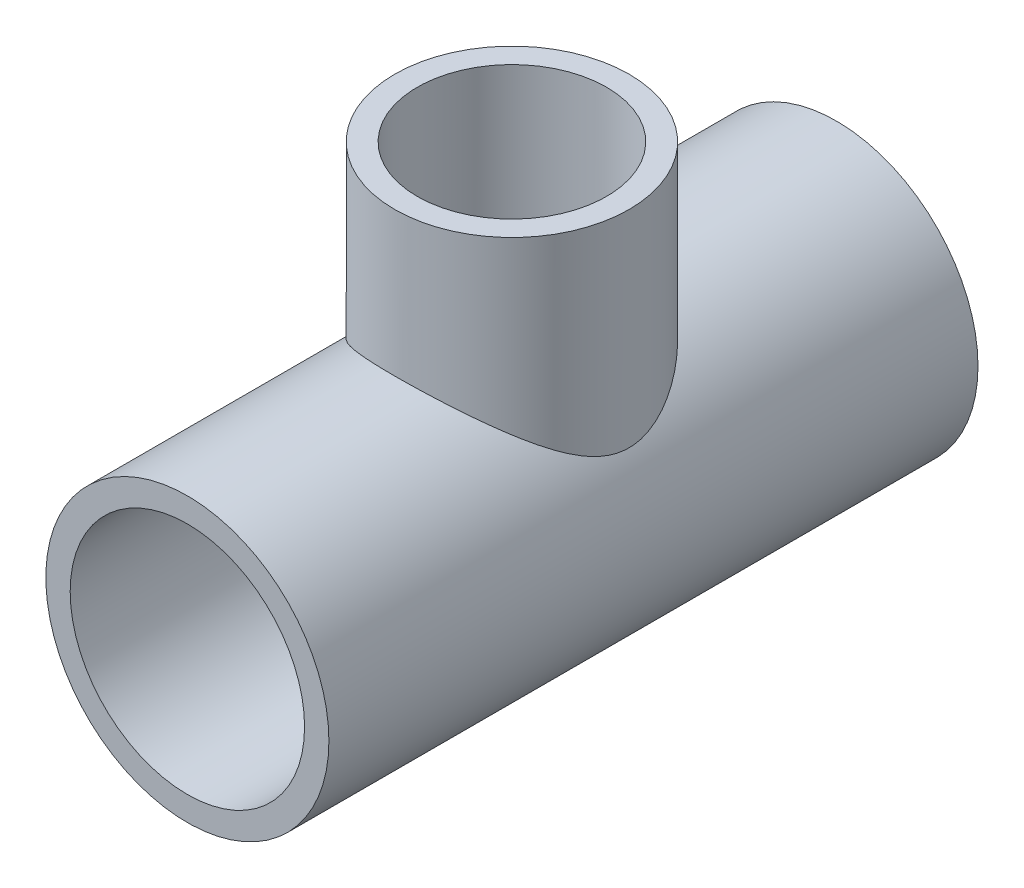
ISO-10303-21;
HEADER;
FILE_DESCRIPTION(('STEP AP214'),'2;1');
FILE_NAME('part.step','',(''),(''),'','','');
FILE_SCHEMA(('AUTOMOTIVE_DESIGN { 1 0 10303 214 1 1 1 1 }'));
ENDSEC;
DATA;
#1=APPLICATION_CONTEXT('core data for automotive mechanical design processes');
#2=APPLICATION_PROTOCOL_DEFINITION('international standard','automotive_design',2000,#1);
#3=PRODUCT_CONTEXT('',#1,'mechanical');
#4=PRODUCT('Part','Part','',(#3));
#5=PRODUCT_RELATED_PRODUCT_CATEGORY('part','',(#4));
#6=PRODUCT_DEFINITION_FORMATION('','',#4);
#7=PRODUCT_DEFINITION_CONTEXT('part definition',#1,'design');
#8=PRODUCT_DEFINITION('design','',#6,#7);
#9=PRODUCT_DEFINITION_SHAPE('','',#8);
#10=(LENGTH_UNIT() NAMED_UNIT(*) SI_UNIT(.MILLI.,.METRE.));
#11=(NAMED_UNIT(*) PLANE_ANGLE_UNIT() SI_UNIT($,.RADIAN.));
#12=(NAMED_UNIT(*) SI_UNIT($,.STERADIAN.) SOLID_ANGLE_UNIT());
#13=UNCERTAINTY_MEASURE_WITH_UNIT(LENGTH_MEASURE(1.E-05),#10,'distance_accuracy_value','');
#14=(GEOMETRIC_REPRESENTATION_CONTEXT(3) GLOBAL_UNCERTAINTY_ASSIGNED_CONTEXT((#13)) GLOBAL_UNIT_ASSIGNED_CONTEXT((#10,
#11,#12)) REPRESENTATION_CONTEXT('',''));
#15=CARTESIAN_POINT('',(0.,0.,0.));
#16=DIRECTION('',(0.,0.,1.));
#17=DIRECTION('',(1.,0.,0.));
#18=AXIS2_PLACEMENT_3D('',#15,#16,#17);
#19=CARTESIAN_POINT('',(0.,0.,91.44));
#20=DIRECTION('',(0.,0.,-1.));
#21=DIRECTION('',(-1.,0.,0.));
#22=AXIS2_PLACEMENT_3D('',#19,#20,#21);
#23=CYLINDRICAL_SURFACE('',#22,19.939);
#24=CARTESIAN_POINT('',(0.,19.939,62.23));
#25=CARTESIAN_POINT('',(-0.392783405292877,19.9389961701152,62.2299960612544));
#26=CARTESIAN_POINT('',(-0.785640186108571,19.9273668865796,62.2159565841073));
#27=CARTESIAN_POINT('',(-1.56805239338916,19.8811123017853,62.1600500239623));
#28=CARTESIAN_POINT('',(-1.95760696256745,19.8464812036583,62.1181759261404));
#29=CARTESIAN_POINT('',(-2.73057137688883,19.754981748979,62.0073160234988));
#30=CARTESIAN_POINT('',(-3.1139748252652,19.6980916305771,61.938303686257));
#31=CARTESIAN_POINT('',(-3.87138557414284,19.5633350384613,61.7743649373392));
#32=CARTESIAN_POINT('',(-4.24539325198439,19.4854694086146,61.6794395681703));
#33=CARTESIAN_POINT('',(-4.97936657296411,19.3109053626636,61.4658314693263));
#34=CARTESIAN_POINT('',(-5.33940489736045,19.2143266977219,61.3472996775844));
#35=CARTESIAN_POINT('',(-6.04600321066344,19.0038282317555,61.0877464139055));
#36=CARTESIAN_POINT('',(-6.39256335183005,18.889908626699,60.9467251961182));
#37=CARTESIAN_POINT('',(-7.0708141324814,18.6466382408793,60.6438613108664));
#38=CARTESIAN_POINT('',(-7.40250468938375,18.5172873744289,60.4820185277827));
#39=CARTESIAN_POINT('',(-8.05006725828212,18.2450969909378,60.1391127084111));
#40=CARTESIAN_POINT('',(-8.36593590835296,18.1022546255998,59.9580456125205));
#41=CARTESIAN_POINT('',(-9.09332768357189,17.7508409542491,59.5089390834768));
#42=CARTESIAN_POINT('',(-9.4977508332775,17.53728942011,59.2332547338749));
#43=CARTESIAN_POINT('',(-10.2749387941315,17.0935585190217,58.6521823962372));
#44=CARTESIAN_POINT('',(-10.6476928919433,16.8633735734959,58.3467844307281));
#45=CARTESIAN_POINT('',(-11.3620214838154,16.3906090166872,57.7081068881305));
#46=CARTESIAN_POINT('',(-11.7035141630012,16.1479993354566,57.3747582918527));
#47=CARTESIAN_POINT('',(-12.3541212827913,15.6558535879754,56.6827255812915));
#48=CARTESIAN_POINT('',(-12.6632397406975,15.4063183859821,56.3240446197601));
#49=CARTESIAN_POINT('',(-13.2543571821007,14.9009926097728,55.5756387502431));
#50=CARTESIAN_POINT('',(-13.5357692254304,14.6451701912157,55.1854719114607));
#51=CARTESIAN_POINT('',(-14.0647961459784,14.1378747352497,54.3799023256704));
#52=CARTESIAN_POINT('',(-14.312399743478,13.8864031737623,53.9644912227381));
#53=CARTESIAN_POINT('',(-14.7722204215409,13.3961875161993,53.1089751497637));
#54=CARTESIAN_POINT('',(-14.9845230142917,13.1574136458984,52.6689334090436));
#55=CARTESIAN_POINT('',(-15.3725233866393,12.7019099754091,51.7622225908647));
#56=CARTESIAN_POINT('',(-15.5482525311853,12.4851613689479,51.2955767699788));
#57=CARTESIAN_POINT('',(-15.7900241058665,12.1761429268623,50.5503943005047));
#58=CARTESIAN_POINT('',(-15.8699108915205,12.0716464920868,50.2813663084645));
#59=CARTESIAN_POINT('',(-16.016869639299,11.8759653175975,49.7349748333035));
#60=CARTESIAN_POINT('',(-16.0839399548237,11.7847822886818,49.4576102844317));
#61=CARTESIAN_POINT('',(-16.2042489317599,11.6188016750439,48.895656587861));
#62=CARTESIAN_POINT('',(-16.25751487572,11.5439718170228,48.6110829297272));
#63=CARTESIAN_POINT('',(-16.3494366490625,11.4134147135974,48.0353661788215));
#64=CARTESIAN_POINT('',(-16.3881001327055,11.3576774617347,47.7442266127928));
#65=CARTESIAN_POINT('',(-16.4503741657615,11.2672974773367,47.153376275942));
#66=CARTESIAN_POINT('',(-16.4737958676471,11.2329196176889,46.85360432071));
#67=CARTESIAN_POINT('',(-16.5041973207895,11.1882054490934,46.2514378010779));
#68=CARTESIAN_POINT('',(-16.5111784647061,11.1778671037885,45.9490434609951));
#69=CARTESIAN_POINT('',(-16.5084964830161,11.1818276693203,45.3444425522472));
#70=CARTESIAN_POINT('',(-16.4988306865683,11.1961305336019,45.0422360214965));
#71=CARTESIAN_POINT('',(-16.4631322681893,11.2485544120525,44.4408791630354));
#72=CARTESIAN_POINT('',(-16.4370975667211,11.2866784525055,44.1417292285489));
#73=CARTESIAN_POINT('',(-16.3660629342201,11.3894670643618,43.5201899009702));
#74=CARTESIAN_POINT('',(-16.3194721560966,11.4563421026462,43.1983514577935));
#75=CARTESIAN_POINT('',(-16.2086306654485,11.6126286336025,42.5633629858421));
#76=CARTESIAN_POINT('',(-16.1443769656807,11.7020439381864,42.2502144366182));
#77=CARTESIAN_POINT('',(-15.9992851646176,11.8996481363419,41.6329750138552));
#78=CARTESIAN_POINT('',(-15.9184040827348,12.0078855697197,41.328910001592));
#79=CARTESIAN_POINT('',(-15.7412666797049,12.2391788142262,40.731023514651));
#80=CARTESIAN_POINT('',(-15.6450044145547,12.3622403495328,40.4372060537986));
#81=CARTESIAN_POINT('',(-15.3785985492522,12.6936926931827,39.6940557814326));
#82=CARTESIAN_POINT('',(-15.1977687032512,12.9105082291697,39.2522904237967));
#83=CARTESIAN_POINT('',(-14.802764076096,13.3615856567957,38.393202224307));
#84=CARTESIAN_POINT('',(-14.5885704216906,13.5958573836905,37.975893402055));
#85=CARTESIAN_POINT('',(-14.1279419413708,14.073924002867,37.1643422464437));
#86=CARTESIAN_POINT('',(-13.8814645979965,14.3177311509361,36.7701313415924));
#87=CARTESIAN_POINT('',(-13.3572075657742,14.8080241659555,36.0050584857791));
#88=CARTESIAN_POINT('',(-13.0794339746337,15.0545095026648,35.6341920083019));
#89=CARTESIAN_POINT('',(-12.4788575456819,15.5564190719477,34.8990001292566));
#90=CARTESIAN_POINT('',(-12.154545003236,15.811713670453,34.5358167053663));
#91=CARTESIAN_POINT('',(-11.4717717450427,16.3138531096182,33.8365098770111));
#92=CARTESIAN_POINT('',(-11.1133059132954,16.560696676802,33.5003905405753));
#93=CARTESIAN_POINT('',(-10.3631342690973,17.0401575050117,32.8580840228777));
#94=CARTESIAN_POINT('',(-9.97149527210491,17.2728018115195,32.5518392279916));
#95=CARTESIAN_POINT('',(-9.15494659320233,17.7191130501294,31.9716301317617));
#96=CARTESIAN_POINT('',(-8.73004907452329,17.9327868596261,31.6976541201196));
#97=CARTESIAN_POINT('',(-7.9608320367902,18.2844000648241,31.2510875843767));
#98=CARTESIAN_POINT('',(-7.62362342090317,18.4277504288897,31.0704673204951));
#99=CARTESIAN_POINT('',(-6.9323931798753,18.6987531063733,30.7309972779359));
#100=CARTESIAN_POINT('',(-6.57837561414232,18.8264091835433,30.5721422785344));
#101=CARTESIAN_POINT('',(-5.85495857615085,19.0637885586551,30.2781110577493));
#102=CARTESIAN_POINT('',(-5.48556498008741,19.17351862977,30.1429258915488));
#103=CARTESIAN_POINT('',(-4.73312160048301,19.3729900132641,29.898047936171));
#104=CARTESIAN_POINT('',(-4.35007157070589,19.4627309650121,29.7883556069178));
#105=CARTESIAN_POINT('',(-3.56990463548356,19.6208828498744,29.5955313250195));
#106=CARTESIAN_POINT('',(-3.1727054099056,19.6891331721679,29.5125992571348));
#107=CARTESIAN_POINT('',(-2.36995626110336,19.8017997821328,29.3759138090709));
#108=CARTESIAN_POINT('',(-1.96440632759534,19.8462160404513,29.322160464827));
#109=CARTESIAN_POINT('',(-1.14865255085361,19.9100884716174,29.2449135252215));
#110=CARTESIAN_POINT('',(-0.738450848231068,19.9295556897874,29.2214065393154));
#111=CARTESIAN_POINT('',(0.0829610907733879,19.9430566799419,29.2051002619036));
#112=CARTESIAN_POINT('',(0.494171225915968,19.9370929083152,29.2122980046166));
#113=CARTESIAN_POINT('',(1.26739282046415,19.9020072756767,29.2546914480175));
#114=CARTESIAN_POINT('',(1.62971283203527,19.8755785175611,29.2866313658267));
#115=CARTESIAN_POINT('',(2.34952393229969,19.8033902036354,29.3740142357515));
#116=CARTESIAN_POINT('',(2.70701545507254,19.7576323975989,29.4294550604352));
#117=CARTESIAN_POINT('',(3.41485561273787,19.6476664676419,29.5630012012198));
#118=CARTESIAN_POINT('',(3.7652037372405,19.5834570302806,29.6411081307638));
#119=CARTESIAN_POINT('',(4.45670353678169,19.437756748633,29.8188881047043));
#120=CARTESIAN_POINT('',(4.79785473535906,19.3562650109419,29.9185622640198));
#121=CARTESIAN_POINT('',(5.47678568258123,19.1753675719841,30.1406756741876));
#122=CARTESIAN_POINT('',(5.8143179275952,19.0756008707597,30.2635756415255));
#123=CARTESIAN_POINT('',(6.47653838181714,18.8610533726083,30.5291528456473));
#124=CARTESIAN_POINT('',(6.80122678247126,18.746272799583,30.6718297874991));
#125=CARTESIAN_POINT('',(7.43674678880093,18.5033579719264,30.9755451413057));
#126=CARTESIAN_POINT('',(7.74757672273763,18.3752221124438,31.1365857601693));
#127=CARTESIAN_POINT('',(8.35462725759089,18.1072930283297,31.4756597835208));
#128=CARTESIAN_POINT('',(8.65084492365357,17.9674974769141,31.6536965807608));
#129=CARTESIAN_POINT('',(9.35858272985782,17.6125056216531,32.1095088318761));
#130=CARTESIAN_POINT('',(9.76174724590086,17.3917735563671,32.3960110330857));
#131=CARTESIAN_POINT('',(10.5354000349041,16.9343199639772,32.9989085793631));
#132=CARTESIAN_POINT('',(10.9058755729815,16.6975922682028,33.3153154760676));
#133=CARTESIAN_POINT('',(11.6148951698307,16.2124331143992,33.9764902329375));
#134=CARTESIAN_POINT('',(11.9533353183797,15.9639672427929,34.3213440212143));
#135=CARTESIAN_POINT('',(12.5968527240436,15.4612320581583,35.0367931254097));
#136=CARTESIAN_POINT('',(12.9019348807096,15.2069636040501,35.4073846479143));
#137=CARTESIAN_POINT('',(13.4837637364,14.693702540562,36.1802759081873));
#138=CARTESIAN_POINT('',(13.7599186147605,14.4347053986598,36.5830182536305));
#139=CARTESIAN_POINT('',(14.2772775871283,13.9231949659275,37.4146186843897));
#140=CARTESIAN_POINT('',(14.5184674489229,13.6706843495999,37.8434873038711));
#141=CARTESIAN_POINT('',(14.9638241984647,13.1816780193941,38.7265805791061));
#142=CARTESIAN_POINT('',(15.1681118067442,12.9451317320232,39.1807159570957));
#143=CARTESIAN_POINT('',(15.5382026804678,12.4984752247713,40.1166874758512));
#144=CARTESIAN_POINT('',(15.7040468755602,12.2883369991448,40.5984934679466));
#145=CARTESIAN_POINT('',(15.9254676136498,11.9983053021407,41.3571426417022));
#146=CARTESIAN_POINT('',(15.9962467322842,11.9035989826424,41.6239513433823));
#147=CARTESIAN_POINT('',(16.1251635096673,11.7283685207827,42.1652052994179));
#148=CARTESIAN_POINT('',(16.183303044578,11.6478422739341,42.4396494135765));
#149=CARTESIAN_POINT('',(16.2859778738208,11.503846229111,42.9948366903884));
#150=CARTESIAN_POINT('',(16.3305437337563,11.440338148505,43.2755641493137));
#151=CARTESIAN_POINT('',(16.4054069328522,11.3327252809844,43.8426383132286));
#152=CARTESIAN_POINT('',(16.4357045219427,11.2886201541991,44.1289849196989));
#153=CARTESIAN_POINT('',(16.4815505043017,11.2215821148499,44.7081841611502));
#154=CARTESIAN_POINT('',(16.4969534399938,11.1988580614727,45.0010729334554));
#155=CARTESIAN_POINT('',(16.5120839288934,11.1765377110829,45.5881321556));
#156=CARTESIAN_POINT('',(16.5118123604411,11.1769401181504,45.8823025326994));
#157=CARTESIAN_POINT('',(16.4955966976314,11.2008576122024,46.469479969068));
#158=CARTESIAN_POINT('',(16.4796406100848,11.2243903858523,46.7624859658453));
#159=CARTESIAN_POINT('',(16.4324657363856,11.293339071295,47.3446577975228));
#160=CARTESIAN_POINT('',(16.4012446566602,11.3387582715195,47.6338230486408));
#161=CARTESIAN_POINT('',(16.3176800002929,11.4587631604087,48.2553121749009));
#162=CARTESIAN_POINT('',(16.2626378880612,11.5370075947306,48.5865632316065));
#163=CARTESIAN_POINT('',(16.1340190482632,11.716196557267,49.2391254080524));
#164=CARTESIAN_POINT('',(16.0604377588393,11.8171466719161,49.5604340594253));
#165=CARTESIAN_POINT('',(15.8958947578734,12.0375739521547,50.1930016306969));
#166=CARTESIAN_POINT('',(15.8048866395348,12.1571004218647,50.5042310628329));
#167=CARTESIAN_POINT('',(15.606789542769,12.4103879200031,51.1155036793034));
#168=CARTESIAN_POINT('',(15.4996994697889,12.5441499171343,51.4155461005032));
#169=CARTESIAN_POINT('',(15.2047037404764,12.9019690848564,52.1732335626558));
#170=CARTESIAN_POINT('',(15.0056158509756,13.1339010996633,52.6228309683159));
#171=CARTESIAN_POINT('',(14.5722136430075,13.6131900816313,53.4961472834159));
#172=CARTESIAN_POINT('',(14.3378801933123,13.8605553830169,53.9198519615905));
#173=CARTESIAN_POINT('',(13.8348952236558,14.3626550932646,54.7426660162536));
#174=CARTESIAN_POINT('',(13.5662002539506,14.6173985106302,55.1417432877287));
#175=CARTESIAN_POINT('',(12.9952972720364,15.1272099620001,55.914761222515));
#176=CARTESIAN_POINT('',(12.6930957769874,15.3822779233717,56.2887067514084));
#177=CARTESIAN_POINT('',(12.0434640480628,15.8964323642513,57.0241833275139));
#178=CARTESIAN_POINT('',(11.6947758380173,16.1553194903527,57.3847462108857));
#179=CARTESIAN_POINT('',(10.9614545249185,16.6615985519563,58.076403340147));
#180=CARTESIAN_POINT('',(10.5768152830076,16.9089885134099,58.4074925343103));
#181=CARTESIAN_POINT('',(9.77267827346687,17.3860985645201,59.0367093190281));
#182=CARTESIAN_POINT('',(9.35325838672658,17.6158560266571,59.3349072453277));
#183=CARTESIAN_POINT('',(8.69847488898245,17.9432394941796,59.7550945849723));
#184=CARTESIAN_POINT('',(8.475971655666,18.0494779476786,59.8906213857263));
#185=CARTESIAN_POINT('',(8.02248821062575,18.2555589761064,60.1521970425678));
#186=CARTESIAN_POINT('',(7.79150601125616,18.3554000360978,60.2782436549146));
#187=CARTESIAN_POINT('',(7.22487692109828,18.5874473678646,60.5699252993513));
#188=CARTESIAN_POINT('',(6.88518244167881,18.7161185869499,60.7305754435317));
#189=CARTESIAN_POINT('',(6.19079054801735,18.9571320610648,61.0300335607317));
#190=CARTESIAN_POINT('',(5.83609691523855,19.0694784004753,61.1688469978766));
#191=CARTESIAN_POINT('',(5.11370394068798,19.2757526659159,61.4227542699075));
#192=CARTESIAN_POINT('',(4.74602421479497,19.3697070777228,61.5378822260611));
#193=CARTESIAN_POINT('',(3.9992635506032,19.5375522186127,61.742977403487));
#194=CARTESIAN_POINT('',(3.62018539646618,19.6114478037167,61.8329507145802));
#195=CARTESIAN_POINT('',(2.9727575458455,19.7179633328003,61.9623933953486));
#196=CARTESIAN_POINT('',(2.70671233524424,19.7562698673988,62.0088638276831));
#197=CARTESIAN_POINT('',(2.17138216925906,19.8222480180985,62.0888243025539));
#198=CARTESIAN_POINT('',(1.90209758367755,19.8499208364679,62.1223158125154));
#199=CARTESIAN_POINT('',(1.36121932404046,19.8943321665581,62.176034157731));
#200=CARTESIAN_POINT('',(1.08962493229313,19.9110671438654,62.19625670531));
#201=CARTESIAN_POINT('',(0.545365380274557,19.9334016149217,62.2232400566336));
#202=CARTESIAN_POINT('',(0.272700374378057,19.9390026589998,62.2300027345794));
#203=CARTESIAN_POINT('',(0.,19.939,62.23));
#204=B_SPLINE_CURVE_WITH_KNOTS('',3,(#24,#25,#26,#27,#28,#29,#30,#31,#32,#33,#34,#35,#36,#37,
#38,#39,#40,#41,#42,#43,#44,#45,#46,#47,#48,#49,#50,#51,#52,#53,#54,#55,#56,#57,#58,#59,#60,#61,
#62,#63,#64,#65,#66,#67,#68,#69,#70,#71,#72,#73,#74,#75,#76,#77,#78,#79,#80,#81,#82,#83,#84,#85,
#86,#87,#88,#89,#90,#91,#92,#93,#94,#95,#96,#97,#98,#99,#100,#101,#102,#103,#104,#105,#106,#107,
#108,#109,#110,#111,#112,#113,#114,#115,#116,#117,#118,#119,#120,#121,#122,#123,#124,#125,#126,
#127,#128,#129,#130,#131,#132,#133,#134,#135,#136,#137,#138,#139,#140,#141,#142,#143,#144,#145,
#146,#147,#148,#149,#150,#151,#152,#153,#154,#155,#156,#157,#158,#159,#160,#161,#162,#163,#164,
#165,#166,#167,#168,#169,#170,#171,#172,#173,#174,#175,#176,#177,#178,#179,#180,#181,#182,#183,
#184,#185,#186,#187,#188,#189,#190,#191,#192,#193,#194,#195,#196,#197,#198,#199,#200,#201,#202,
#203),.UNSPECIFIED.,.T.,.F.,(4,2,2,2,2,2,2,2,2,2,2,2,2,2,2,2,2,2,2,2,2,2,2,2,2,2,2,2,2,2,2,2,2,
2,2,2,2,2,2,2,2,2,2,2,2,2,2,2,2,2,2,2,2,2,2,2,2,2,2,2,2,2,2,2,2,2,2,2,2,2,2,2,2,2,2,2,2,2,2,2,2,
2,2,2,2,2,2,2,2,4),(0.,1.17805884660458,2.35641469780046,3.53592547571467,4.71538880773163,
5.88753978086161,7.05967750862232,8.23182174537161,9.40421399827651,11.0039401250271,
12.6042052866692,14.2085454668999,15.8126863288359,17.445644470962,19.0791461025812,
20.7086312442386,22.3367131478637,23.2345384161017,24.1324789552595,25.0286310594735,
25.9243127680686,26.83089082999,27.7373920940225,28.6440388110022,29.5508007333918,
30.5452697746024,31.5399071090587,32.5371485885744,33.5347763847154,35.1051932153483,
36.6765016479127,38.2499006941171,39.8229937103582,41.4706016272549,43.1184567371641,
44.7630683532072,46.4070812908595,47.6315169053423,48.8556583045415,50.0793360982336,
51.30303596696,52.5356752975691,53.7683161462408,55.0004110972013,56.2323870423464,
57.3251453120826,58.4178046804192,59.510541846703,60.6033355155844,61.7206550060318,
62.837957835798,63.955395082506,65.0730558586859,66.6955611099408,68.3186956869812,
69.9469265577431,71.5749179552377,73.2315042541328,74.8887629704265,76.5404979352697,
78.1904661822897,79.0653750960198,79.9401540534746,80.8129483404489,81.6857273385629,
82.5669460958485,83.4481154729936,84.3299591620588,85.211935389312,86.2446893806779,
87.2776977460991,88.3134962112525,89.3493652058039,90.977903302745,92.6073285788755,
94.2388350032997,95.8700246477225,97.5614419342892,99.2531485701504,100.941164445187,
101.784931868835,102.628898368324,103.819257475274,105.009318247258,106.197652425681,
107.385698664395,108.203539787762,109.021288417234,109.8393011605,110.65719999273),.UNSPECIFIED.);
#205=CARTESIAN_POINT('',(0.,19.939,62.23));
#206=VERTEX_POINT('',#205);
#207=EDGE_CURVE('E38',#206,#206,#204,.T.);
#208=ORIENTED_EDGE('',*,*,#207,.T.);
#209=EDGE_LOOP('',(#208));
#210=FACE_BOUND('',#209,.T.);
#211=CARTESIAN_POINT('',(0.,0.,91.44));
#212=DIRECTION('',(0.,0.,1.));
#213=DIRECTION('',(1.,0.,0.));
#214=AXIS2_PLACEMENT_3D('',#211,#212,#213);
#215=CIRCLE('',#214,19.939);
#216=CARTESIAN_POINT('',(19.939,0.,91.44));
#217=VERTEX_POINT('',#216);
#218=EDGE_CURVE('E10',#217,#217,#215,.T.);
#219=ORIENTED_EDGE('',*,*,#218,.F.);
#220=EDGE_LOOP('',(#219));
#221=FACE_BOUND('',#220,.T.);
#222=CARTESIAN_POINT('',(0.,0.,0.));
#223=DIRECTION('',(0.,0.,1.));
#224=DIRECTION('',(1.,0.,0.));
#225=AXIS2_PLACEMENT_3D('',#222,#223,#224);
#226=CIRCLE('',#225,19.939);
#227=CARTESIAN_POINT('',(19.939,0.,0.));
#228=VERTEX_POINT('',#227);
#229=EDGE_CURVE('E46',#228,#228,#226,.T.);
#230=ORIENTED_EDGE('',*,*,#229,.T.);
#231=EDGE_LOOP('',(#230));
#232=FACE_BOUND('',#231,.T.);
#233=ADVANCED_FACE('F34',(#210,#221,#232),#23,.T.);
#234=CARTESIAN_POINT('',(0.,0.,91.44));
#235=DIRECTION('',(0.,0.,1.));
#236=DIRECTION('',(1.,0.,0.));
#237=AXIS2_PLACEMENT_3D('',#234,#235,#236);
#238=PLANE('',#237);
#239=CARTESIAN_POINT('',(0.,0.,91.44));
#240=DIRECTION('',(0.,0.,1.));
#241=DIRECTION('',(1.,0.,0.));
#242=AXIS2_PLACEMENT_3D('',#239,#240,#241);
#243=CIRCLE('',#242,16.51);
#244=CARTESIAN_POINT('',(16.51,0.,91.44));
#245=VERTEX_POINT('',#244);
#246=EDGE_CURVE('E56',#245,#245,#243,.T.);
#247=ORIENTED_EDGE('',*,*,#246,.F.);
#248=EDGE_LOOP('',(#247));
#249=FACE_BOUND('',#248,.T.);
#250=ORIENTED_EDGE('',*,*,#218,.T.);
#251=EDGE_LOOP('',(#250));
#252=FACE_BOUND('',#251,.T.);
#253=ADVANCED_FACE('F90',(#249,#252),#238,.T.);
#254=CARTESIAN_POINT('',(0.,0.,0.));
#255=DIRECTION('',(0.,0.,1.));
#256=DIRECTION('',(1.,0.,0.));
#257=AXIS2_PLACEMENT_3D('',#254,#255,#256);
#258=PLANE('',#257);
#259=CARTESIAN_POINT('',(0.,0.,0.));
#260=DIRECTION('',(0.,0.,1.));
#261=DIRECTION('',(1.,0.,0.));
#262=AXIS2_PLACEMENT_3D('',#259,#260,#261);
#263=CIRCLE('',#262,16.51);
#264=CARTESIAN_POINT('',(16.51,0.,0.));
#265=VERTEX_POINT('',#264);
#266=EDGE_CURVE('E55',#265,#265,#263,.T.);
#267=ORIENTED_EDGE('',*,*,#266,.T.);
#268=EDGE_LOOP('',(#267));
#269=FACE_BOUND('',#268,.T.);
#270=ORIENTED_EDGE('',*,*,#229,.F.);
#271=EDGE_LOOP('',(#270));
#272=FACE_BOUND('',#271,.T.);
#273=ADVANCED_FACE('F88',(#269,#272),#258,.F.);
#274=CARTESIAN_POINT('',(0.,-0.380999999999999,45.72));
#275=DIRECTION('',(0.,1.,0.));
#276=DIRECTION('',(0.,0.,1.));
#277=AXIS2_PLACEMENT_3D('',#274,#275,#276);
#278=CYLINDRICAL_SURFACE('',#277,16.51);
#279=CARTESIAN_POINT('',(0.,40.259,45.72));
#280=DIRECTION('',(0.,1.,0.));
#281=DIRECTION('',(0.,0.,1.));
#282=AXIS2_PLACEMENT_3D('',#279,#280,#281);
#283=CIRCLE('',#282,16.51);
#284=CARTESIAN_POINT('',(0.,40.259,62.23));
#285=VERTEX_POINT('',#284);
#286=EDGE_CURVE('E52',#285,#285,#283,.T.);
#287=ORIENTED_EDGE('',*,*,#286,.F.);
#288=EDGE_LOOP('',(#287));
#289=FACE_BOUND('',#288,.T.);
#290=ORIENTED_EDGE('',*,*,#207,.F.);
#291=EDGE_LOOP('',(#290));
#292=FACE_BOUND('',#291,.T.);
#293=ADVANCED_FACE('F83',(#289,#292),#278,.T.);
#294=CARTESIAN_POINT('',(0.,40.259,45.72));
#295=DIRECTION('',(0.,1.,0.));
#296=DIRECTION('',(0.,0.,1.));
#297=AXIS2_PLACEMENT_3D('',#294,#295,#296);
#298=PLANE('',#297);
#299=CARTESIAN_POINT('',(0.,40.259,45.72));
#300=DIRECTION('',(0.,1.,0.));
#301=DIRECTION('',(0.,0.,1.));
#302=AXIS2_PLACEMENT_3D('',#299,#300,#301);
#303=CIRCLE('',#302,13.335);
#304=CARTESIAN_POINT('',(0.,40.259,59.055));
#305=VERTEX_POINT('',#304);
#306=EDGE_CURVE('E59',#305,#305,#303,.T.);
#307=ORIENTED_EDGE('',*,*,#306,.F.);
#308=EDGE_LOOP('',(#307));
#309=FACE_BOUND('',#308,.T.);
#310=ORIENTED_EDGE('',*,*,#286,.T.);
#311=EDGE_LOOP('',(#310));
#312=FACE_BOUND('',#311,.T.);
#313=ADVANCED_FACE('F80',(#309,#312),#298,.T.);
#314=CARTESIAN_POINT('',(0.,0.,0.));
#315=DIRECTION('',(0.,0.,1.));
#316=DIRECTION('',(1.,0.,0.));
#317=AXIS2_PLACEMENT_3D('',#314,#315,#316);
#318=CYLINDRICAL_SURFACE('',#317,16.51);
#319=CARTESIAN_POINT('',(0.,16.51,59.055));
#320=CARTESIAN_POINT('',(-0.319487858860098,16.5100012023144,59.0550012264037));
#321=CARTESIAN_POINT('',(-0.638960197963048,16.5007084330153,59.0435012462574));
#322=CARTESIAN_POINT('',(-1.27531673128414,16.4637564321452,58.9977100766729));
#323=CARTESIAN_POINT('',(-1.59219990247123,16.4360902654472,58.9634102813306));
#324=CARTESIAN_POINT('',(-2.22111555351123,16.3629802316577,58.8725652731099));
#325=CARTESIAN_POINT('',(-2.53314067538193,16.3175116969141,58.8159891927303));
#326=CARTESIAN_POINT('',(-3.14957047714748,16.2098182573811,58.6815566233243));
#327=CARTESIAN_POINT('',(-3.45397570636091,16.1475945642964,58.6037016731438));
#328=CARTESIAN_POINT('',(-4.05137556024155,16.0081219702188,58.4284573990524));
#329=CARTESIAN_POINT('',(-4.34442962031429,15.9309694280772,58.3311932330342));
#330=CARTESIAN_POINT('',(-4.91959917666342,15.7628496925167,58.1181384343438));
#331=CARTESIAN_POINT('',(-5.20171471085171,15.6718825469832,58.0023478658895));
#332=CARTESIAN_POINT('',(-5.75383060850008,15.4776989394931,57.7535919012233));
#333=CARTESIAN_POINT('',(-6.0238321970242,15.3744837200299,57.6206282469969));
#334=CARTESIAN_POINT('',(-6.55096204100967,15.1573840559014,57.3387988269126));
#335=CARTESIAN_POINT('',(-6.8080876223425,15.0434974089464,57.189929777725));
#336=CARTESIAN_POINT('',(-7.39725700442099,14.7648589108771,56.8223523796184));
#337=CARTESIAN_POINT('',(-7.72372665169144,14.5963374382125,56.5975346092328));
#338=CARTESIAN_POINT('',(-8.35123953433567,14.246614251404,56.1235453018593));
#339=CARTESIAN_POINT('',(-8.65227447798727,14.0654084370926,55.8743658796346));
#340=CARTESIAN_POINT('',(-9.2292419387171,13.6937661065704,55.3530106974038));
#341=CARTESIAN_POINT('',(-9.50510675951616,13.5033066927873,55.0807765100757));
#342=CARTESIAN_POINT('',(-10.0306330053513,13.1176488094157,54.5153181095056));
#343=CARTESIAN_POINT('',(-10.2802974852744,12.9224508955984,54.2220963500773));
#344=CARTESIAN_POINT('',(-10.7571306545341,12.5284241592535,53.6104494275152));
#345=CARTESIAN_POINT('',(-10.983866554159,12.3295879949847,53.2916914699299));
#346=CARTESIAN_POINT('',(-11.4097378940823,11.9365793966576,52.6333138761671));
#347=CARTESIAN_POINT('',(-11.6088644289393,11.7424084840012,52.2936875596109));
#348=CARTESIAN_POINT('',(-11.9779923230928,11.3656115373119,51.5941672760632));
#349=CARTESIAN_POINT('',(-12.1480704180232,11.1829559162998,51.2343301526014));
#350=CARTESIAN_POINT('',(-12.4578646741487,10.8367706557908,50.4933740657695));
#351=CARTESIAN_POINT('',(-12.5976069249601,10.6732246378897,50.1122737467748));
#352=CARTESIAN_POINT('',(-12.8610220333631,10.3548359401429,49.2744305180348));
#353=CARTESIAN_POINT('',(-12.9799076475094,10.2042187149112,48.8144579545792));
#354=CARTESIAN_POINT('',(-13.1218381019628,10.0201537807923,48.1069321296971));
#355=CARTESIAN_POINT('',(-13.1630663057737,9.96579828101564,47.8683297778493));
#356=CARTESIAN_POINT('',(-13.2327278873896,9.87311421368412,47.3862408395986));
#357=CARTESIAN_POINT('',(-13.2611677547749,9.83477751791347,47.1427567961416));
#358=CARTESIAN_POINT('',(-13.3048533518038,9.77560042589965,46.6499923323377));
#359=CARTESIAN_POINT('',(-13.3199649417949,9.75493796948112,46.4006783406442));
#360=CARTESIAN_POINT('',(-13.3361197804005,9.73284146805838,45.9007433243296));
#361=CARTESIAN_POINT('',(-13.3371638345423,9.73140632207076,45.6501223753691));
#362=CARTESIAN_POINT('',(-13.3251520176741,9.74784708741911,45.1497109084457));
#363=CARTESIAN_POINT('',(-13.312087565421,9.76573475150578,44.8999209886828));
#364=CARTESIAN_POINT('',(-13.2721890728176,9.81988843676895,44.4034612095009));
#365=CARTESIAN_POINT('',(-13.2453531315342,9.8561569951245,44.1567917856339));
#366=CARTESIAN_POINT('',(-13.1737779243289,9.95166911764474,43.6335999714043));
#367=CARTESIAN_POINT('',(-13.1270364078286,10.0134451674076,43.3578166006973));
#368=CARTESIAN_POINT('',(-13.0175341857211,10.1553879290788,42.8143253425425));
#369=CARTESIAN_POINT('',(-12.9547701903535,10.2355584174193,42.546619126146));
#370=CARTESIAN_POINT('',(-12.8141962134358,10.4110095891975,42.0195703599267));
#371=CARTESIAN_POINT('',(-12.7363504246868,10.5063261335973,41.7602494630813));
#372=CARTESIAN_POINT('',(-12.566678113682,10.7086955916765,41.2508925594527));
#373=CARTESIAN_POINT('',(-12.4748465140439,10.8157527636842,41.0008599658507));
#374=CARTESIAN_POINT('',(-12.2273659719679,11.0960444705829,40.3838857514285));
#375=CARTESIAN_POINT('',(-12.0631844527427,11.2749986239984,40.0229471234345));
#376=CARTESIAN_POINT('',(-11.7064337340436,11.6449850444804,39.3218409596569));
#377=CARTESIAN_POINT('',(-11.5138506355105,11.8360231988801,38.9816837097115));
#378=CARTESIAN_POINT('',(-11.1011093188381,12.2239848315914,38.3213970221783));
#379=CARTESIAN_POINT('',(-10.8809177782382,12.42091519915,38.0012924997686));
#380=CARTESIAN_POINT('',(-10.4137022899201,12.8151612820712,37.3816823658361));
#381=CARTESIAN_POINT('',(-10.1666829695577,13.0124769252326,37.0821732164549));
#382=CARTESIAN_POINT('',(-9.63778482782843,13.4091725550036,36.4952372614418));
#383=CARTESIAN_POINT('',(-9.35505254436474,13.6084215170709,36.2084890283572));
#384=CARTESIAN_POINT('',(-8.76136541553042,13.998023388357,35.6589715274423));
#385=CARTESIAN_POINT('',(-8.4504063582637,14.1883749634993,35.3962058499716));
#386=CARTESIAN_POINT('',(-7.80140613109185,14.5553024538984,34.8974589667699));
#387=CARTESIAN_POINT('',(-7.4634267778469,14.7319080865037,34.6614194488805));
#388=CARTESIAN_POINT('',(-6.76071049397594,15.067325443871,34.218376230002));
#389=CARTESIAN_POINT('',(-6.39598527904622,15.2261448835176,34.0113599300992));
#390=CARTESIAN_POINT('',(-5.74787956491659,15.4798795472309,33.6835432888925));
#391=CARTESIAN_POINT('',(-5.47055321134548,15.5801880837302,33.5548900980718));
#392=CARTESIAN_POINT('',(-4.90396057072732,15.7676964352342,33.3156499198547));
#393=CARTESIAN_POINT('',(-4.61469726172621,15.8548994949088,33.2050584601229));
#394=CARTESIAN_POINT('',(-4.02565144378869,16.014596489254,33.0033487584134));
#395=CARTESIAN_POINT('',(-3.7258740219903,16.0870974253001,32.9122212463003));
#396=CARTESIAN_POINT('',(-3.11736885900529,16.2160050088503,32.750677930077));
#397=CARTESIAN_POINT('',(-2.80864090258201,16.2724112689659,32.6802626244951));
#398=CARTESIAN_POINT('',(-2.18253932540417,16.3681849738151,32.5609392514173));
#399=CARTESIAN_POINT('',(-1.86512604807246,16.4074520541283,32.5121578426996));
#400=CARTESIAN_POINT('',(-1.22586813241801,16.4675560063474,32.4375674328605));
#401=CARTESIAN_POINT('',(-0.904023499037592,16.488392898807,32.4117584061199));
#402=CARTESIAN_POINT('',(-0.258706223581432,16.5111292131404,32.3835993630441));
#403=CARTESIAN_POINT('',(0.0647660640052346,16.5130325939336,32.3812444425517));
#404=CARTESIAN_POINT('',(0.710565931625729,16.4978634905171,32.4000279002956));
#405=CARTESIAN_POINT('',(1.03289358049423,16.4807921674535,32.4211648409611));
#406=CARTESIAN_POINT('',(1.64505083361022,16.4304494839106,32.4836070401452));
#407=CARTESIAN_POINT('',(1.93521527392684,16.3987584924275,32.5229457334859));
#408=CARTESIAN_POINT('',(2.51037059731706,16.3206114016052,32.6201786676444));
#409=CARTESIAN_POINT('',(2.79536184529539,16.2741563479998,32.6780715942742));
#410=CARTESIAN_POINT('',(3.35852371625621,16.1673308637988,32.8116183399763));
#411=CARTESIAN_POINT('',(3.63669313551435,16.1069579966491,32.8872752689877));
#412=CARTESIAN_POINT('',(4.18473108041459,15.973343174571,33.0553871594922));
#413=CARTESIAN_POINT('',(4.45459915903727,15.9001005280378,33.147843023747));
#414=CARTESIAN_POINT('',(4.9987052287941,15.7377825371931,33.3537497411019));
#415=CARTESIAN_POINT('',(5.27243603774007,15.6480803197114,33.468044578634));
#416=CARTESIAN_POINT('',(5.80845590012854,15.4571320069064,33.7128801322214));
#417=CARTESIAN_POINT('',(6.07074078632169,15.3558817548457,33.8434266996752));
#418=CARTESIAN_POINT('',(6.58295090926315,15.1433721128054,34.1194996636657));
#419=CARTESIAN_POINT('',(6.83287957850674,15.0321155270229,34.2650218650362));
#420=CARTESIAN_POINT('',(7.31997355142747,14.8010396579014,34.569986467463));
#421=CARTESIAN_POINT('',(7.55713708333324,14.6812191912609,34.7294307928654));
#422=CARTESIAN_POINT('',(8.06124174138791,14.4115462614745,35.092106404683));
#423=CARTESIAN_POINT('',(8.32552212246384,14.2602517800823,35.2979673986452));
#424=CARTESIAN_POINT('',(8.83526942966848,13.9501653260645,35.7264470525593));
#425=CARTESIAN_POINT('',(9.080739860629,13.7913747591286,35.9490625752655));
#426=CARTESIAN_POINT('',(9.55341632760854,13.4682771762121,36.4106564010712));
#427=CARTESIAN_POINT('',(9.78057246352549,13.3039567103846,36.649676328061));
#428=CARTESIAN_POINT('',(10.2157400843683,12.9727988825721,37.1427633733682));
#429=CARTESIAN_POINT('',(10.4237556773939,12.8059620696551,37.3968272435021));
#430=CARTESIAN_POINT('',(10.8645897156552,12.4354725703633,37.9776640142352));
#431=CARTESIAN_POINT('',(11.0926807084787,12.2318591362483,38.3080678015125));
#432=CARTESIAN_POINT('',(11.5197219597672,11.8305523297217,38.9909228422525));
#433=CARTESIAN_POINT('',(11.7186577591938,11.6328619331465,39.3433849123418));
#434=CARTESIAN_POINT('',(12.0856102000506,11.251133076838,40.0697398601218));
#435=CARTESIAN_POINT('',(12.2537073354223,11.0670598466607,40.4435735059571));
#436=CARTESIAN_POINT('',(12.5574149021141,10.7212079471805,41.2139363244861));
#437=CARTESIAN_POINT('',(12.6930604624911,10.5594052512144,41.6104403747261));
#438=CARTESIAN_POINT('',(12.8749538675727,10.3356696636152,42.2398988984601));
#439=CARTESIAN_POINT('',(12.9337717578763,10.2618264509443,42.4650439037568));
#440=CARTESIAN_POINT('',(13.0401560860648,10.1262944132353,42.9215295969332));
#441=CARTESIAN_POINT('',(13.0877269383344,10.0646008211485,43.1528678141989));
#442=CARTESIAN_POINT('',(13.1708250635097,9.95561013424087,43.6205116622808));
#443=CARTESIAN_POINT('',(13.2063790528206,9.90828112769969,43.8568050167562));
#444=CARTESIAN_POINT('',(13.2649121885319,9.82978210124828,44.3336350105102));
#445=CARTESIAN_POINT('',(13.2878915082429,9.79861185862998,44.5741715912592));
#446=CARTESIAN_POINT('',(13.3208844773232,9.75371385567496,45.059743108762));
#447=CARTESIAN_POINT('',(13.3307921360824,9.74012869925931,45.3047986758863));
#448=CARTESIAN_POINT('',(13.3370431102713,9.73156776988223,45.7954024519308));
#449=CARTESIAN_POINT('',(13.333386954535,9.73659127139511,46.0409506412714));
#450=CARTESIAN_POINT('',(13.3125957670962,9.76499853003109,46.5306433098709));
#451=CARTESIAN_POINT('',(13.2954470658625,9.78840090706611,46.7747861124902));
#452=CARTESIAN_POINT('',(13.2480743781898,9.85242059755541,47.2595094296524));
#453=CARTESIAN_POINT('',(13.2178484343786,9.89304048806989,47.5000894053421));
#454=CARTESIAN_POINT('',(13.137719571278,9.99928411299829,48.0234402435938));
#455=CARTESIAN_POINT('',(13.0851023891974,10.0682698475444,48.3051110926767));
#456=CARTESIAN_POINT('',(12.963256476435,10.2246698210882,48.8595636096704));
#457=CARTESIAN_POINT('',(12.8940233974711,10.3120888832507,49.1323429294615));
#458=CARTESIAN_POINT('',(12.7399604617899,10.5018312544663,49.6688914811745));
#459=CARTESIAN_POINT('',(12.6550920264592,10.6041912961478,49.9326364698253));
#460=CARTESIAN_POINT('',(12.4708854548068,10.82022597993,50.4501905783169));
#461=CARTESIAN_POINT('',(12.3715463883132,10.9339013492309,50.7039990581074));
#462=CARTESIAN_POINT('',(12.1056448733752,11.2289911764944,51.32725477969));
#463=CARTESIAN_POINT('',(11.9304304431443,11.4156780463635,51.6905343139951));
#464=CARTESIAN_POINT('',(11.550731689296,11.7997354762764,52.3955688389582));
#465=CARTESIAN_POINT('',(11.3462336814576,11.9971110041672,52.7373136583178));
#466=CARTESIAN_POINT('',(10.9086669708549,12.396326578743,53.3999070676466));
#467=CARTESIAN_POINT('',(10.6755659586415,12.5981714591303,53.7207313882177));
#468=CARTESIAN_POINT('',(10.1814552559856,13.0007555899172,54.3407476695245));
#469=CARTESIAN_POINT('',(9.92045034922944,13.2014950236434,54.6399433234625));
#470=CARTESIAN_POINT('',(9.36397182720258,13.6020780625288,55.2228701051224));
#471=CARTESIAN_POINT('',(9.06781251369681,13.8017802708546,55.5060456950823));
#472=CARTESIAN_POINT('',(8.44652954986682,14.1905083474961,56.0470525761952));
#473=CARTESIAN_POINT('',(8.12140117160523,14.3795324648229,56.3048797158222));
#474=CARTESIAN_POINT('',(7.44351191052512,14.7418322251321,56.7920448520741));
#475=CARTESIAN_POINT('',(7.0908141242719,14.9151419750683,57.0214449650125));
#476=CARTESIAN_POINT('',(6.35840025395473,15.24176490887,57.4491332478238));
#477=CARTESIAN_POINT('',(5.97869855743036,15.3950886196426,57.6474378073922));
#478=CARTESIAN_POINT('',(5.31372172554252,15.634213909905,57.9542535869621));
#479=CARTESIAN_POINT('',(5.03483237174126,15.7263724754,58.0717352550274));
#480=CARTESIAN_POINT('',(4.46611986890531,15.8972311546909,58.2885537992533));
#481=CARTESIAN_POINT('',(4.17629953445952,15.9759347044932,58.3878953083078));
#482=CARTESIAN_POINT('',(3.58765736809509,16.1183229367818,58.566999822891));
#483=CARTESIAN_POINT('',(3.28885286265576,16.1820346691064,58.6467981011892));
#484=CARTESIAN_POINT('',(2.68365055538085,16.2933345040901,58.785856686948));
#485=CARTESIAN_POINT('',(2.37725535749197,16.3409280560151,58.8451239357343));
#486=CARTESIAN_POINT('',(1.72798531565952,16.4228989231353,58.9470461515509));
#487=CARTESIAN_POINT('',(1.38452435016725,16.455480614192,58.9874496407417));
#488=CARTESIAN_POINT('',(0.694036742785909,16.4990332464015,59.0414293086829));
#489=CARTESIAN_POINT('',(0.347009217027866,16.5099986941157,59.0549986679513));
#490=CARTESIAN_POINT('',(0.,16.51,59.055));
#491=B_SPLINE_CURVE_WITH_KNOTS('',3,(#319,#320,#321,#322,#323,#324,#325,#326,#327,#328,#329,
#330,#331,#332,#333,#334,#335,#336,#337,#338,#339,#340,#341,#342,#343,#344,#345,#346,#347,#348,
#349,#350,#351,#352,#353,#354,#355,#356,#357,#358,#359,#360,#361,#362,#363,#364,#365,#366,#367,
#368,#369,#370,#371,#372,#373,#374,#375,#376,#377,#378,#379,#380,#381,#382,#383,#384,#385,#386,
#387,#388,#389,#390,#391,#392,#393,#394,#395,#396,#397,#398,#399,#400,#401,#402,#403,#404,#405,
#406,#407,#408,#409,#410,#411,#412,#413,#414,#415,#416,#417,#418,#419,#420,#421,#422,#423,#424,
#425,#426,#427,#428,#429,#430,#431,#432,#433,#434,#435,#436,#437,#438,#439,#440,#441,#442,#443,
#444,#445,#446,#447,#448,#449,#450,#451,#452,#453,#454,#455,#456,#457,#458,#459,#460,#461,#462,
#463,#464,#465,#466,#467,#468,#469,#470,#471,#472,#473,#474,#475,#476,#477,#478,#479,#480,#481,
#482,#483,#484,#485,#486,#487,#488,#489,#490),.UNSPECIFIED.,.T.,.F.,(4,2,2,2,2,2,2,2,2,2,2,2,2,
2,2,2,2,2,2,2,2,2,2,2,2,2,2,2,2,2,2,2,2,2,2,2,2,2,2,2,2,2,2,2,2,2,2,2,2,2,2,2,2,2,2,2,2,2,2,2,2,
2,2,2,2,2,2,2,2,2,2,2,2,2,2,2,2,2,2,2,2,2,2,2,2,4),(0.,0.958098412144372,1.91655866882926,
2.87635173228739,3.83607540376327,4.78979954585671,5.74352038213619,6.69714455174295,
7.65096595846329,8.94130841293506,10.2320699093692,11.5262064998192,12.8201920294907,
14.1352600176622,15.450751201051,16.762711693238,18.0735393554396,19.563054534197,
20.3068060304012,21.0501796746996,21.8009521754095,22.5516816856241,23.3028680707578,
24.0541581730259,24.9122117512494,25.7704416482676,26.6307346935664,27.4913408058115,
28.7945232754978,30.0983456211284,31.4037570645546,32.7089437022469,34.0552770564848,
35.4018116369473,36.7453492547127,38.0883018278949,39.0526611615336,40.0167813431805,
40.9804413122842,41.9441244741121,42.9133774862714,43.882629417502,44.8516786778768,
45.8206686411053,46.7032501118847,47.5857690836247,48.4684426730741,49.3511637107559,
50.2799607205376,51.2090931140342,52.1379659319552,53.066967344549,54.1686750574348,
55.2701769889633,56.3745852676269,57.4787559535493,58.8277555531689,60.1774219193438,
61.52351369427,62.868141654425,63.600022707837,64.3316160243372,65.0615719645,65.7915178437811,
66.5273467851361,67.2631470378465,67.9996937038899,68.7363506527419,69.619171978885,
70.5022245865571,71.3874859476662,72.272804238488,73.6041854307895,74.9361908204535,
76.2697149153435,77.6030107638558,78.9688423214254,80.3348972012224,81.697912390283,
83.0602067353525,84.0083541720346,84.9562591175144,85.9024404074795,86.8483014905514,
87.8886681619145,88.9292991925273),.UNSPECIFIED.);
#492=CARTESIAN_POINT('',(0.,16.51,59.055));
#493=VERTEX_POINT('',#492);
#494=EDGE_CURVE('E64',#493,#493,#491,.T.);
#495=ORIENTED_EDGE('',*,*,#494,.F.);
#496=EDGE_LOOP('',(#495));
#497=FACE_BOUND('',#496,.T.);
#498=ORIENTED_EDGE('',*,*,#266,.F.);
#499=EDGE_LOOP('',(#498));
#500=FACE_BOUND('',#499,.T.);
#501=ORIENTED_EDGE('',*,*,#246,.T.);
#502=EDGE_LOOP('',(#501));
#503=FACE_BOUND('',#502,.T.);
#504=ADVANCED_FACE('F76',(#497,#500,#503),#318,.F.);
#505=CARTESIAN_POINT('',(0.,-19.94,45.72));
#506=DIRECTION('',(0.,1.,0.));
#507=DIRECTION('',(0.,0.,1.));
#508=AXIS2_PLACEMENT_3D('',#505,#506,#507);
#509=CYLINDRICAL_SURFACE('',#508,13.335);
#510=ORIENTED_EDGE('',*,*,#306,.T.);
#511=EDGE_LOOP('',(#510));
#512=FACE_BOUND('',#511,.T.);
#513=ORIENTED_EDGE('',*,*,#494,.T.);
#514=EDGE_LOOP('',(#513));
#515=FACE_BOUND('',#514,.T.);
#516=ADVANCED_FACE('F71',(#512,#515),#509,.F.);
#517=CLOSED_SHELL('',(#233,#253,#273,#293,#313,#504,#516));
#518=MANIFOLD_SOLID_BREP('B2',#517);
#519=ADVANCED_BREP_SHAPE_REPRESENTATION('',(#18,#518),#14);
#520=SHAPE_DEFINITION_REPRESENTATION(#9,#519);
ENDSEC;
END-ISO-10303-21;
